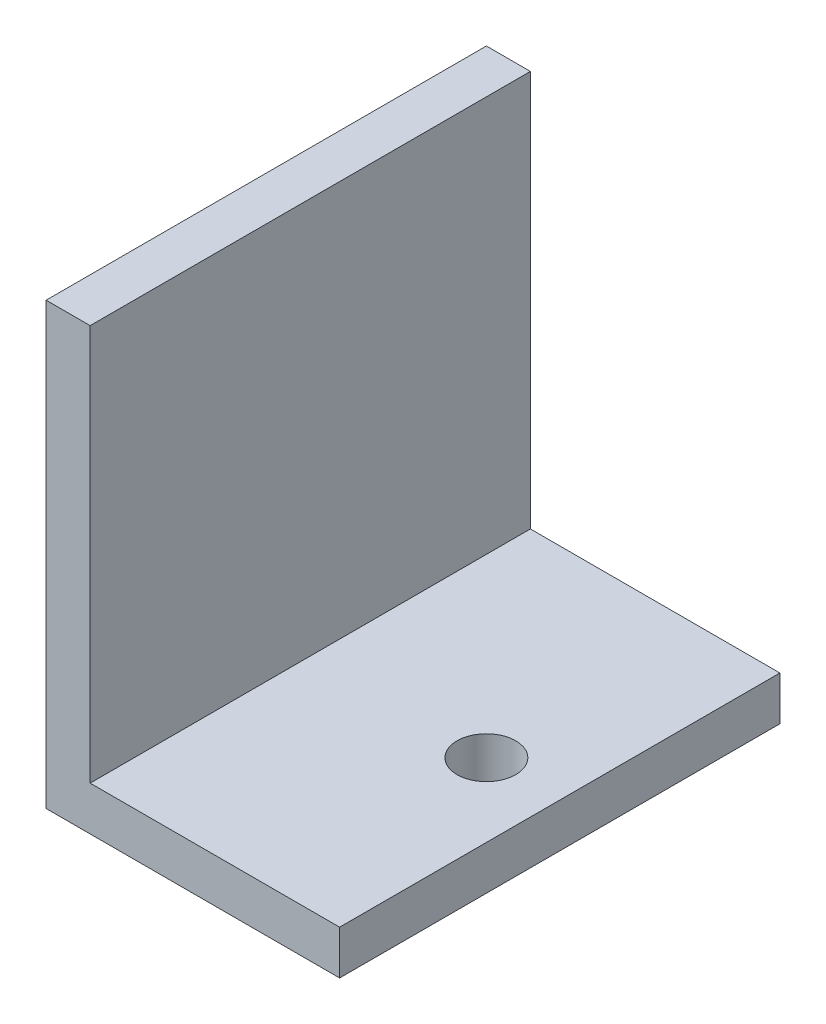
ISO-10303-21;
HEADER;
FILE_DESCRIPTION(('STEP AP214'),'2;1');
FILE_NAME('part.step','',(''),(''),'','','');
FILE_SCHEMA(('AUTOMOTIVE_DESIGN { 1 0 10303 214 1 1 1 1 }'));
ENDSEC;
DATA;
#1=APPLICATION_CONTEXT('core data for automotive mechanical design processes');
#2=APPLICATION_PROTOCOL_DEFINITION('international standard','automotive_design',2000,#1);
#3=PRODUCT_CONTEXT('',#1,'mechanical');
#4=PRODUCT('Part','Part','',(#3));
#5=PRODUCT_RELATED_PRODUCT_CATEGORY('part','',(#4));
#6=PRODUCT_DEFINITION_FORMATION('','',#4);
#7=PRODUCT_DEFINITION_CONTEXT('part definition',#1,'design');
#8=PRODUCT_DEFINITION('design','',#6,#7);
#9=PRODUCT_DEFINITION_SHAPE('','',#8);
#10=(LENGTH_UNIT() NAMED_UNIT(*) SI_UNIT(.MILLI.,.METRE.));
#11=(NAMED_UNIT(*) PLANE_ANGLE_UNIT() SI_UNIT($,.RADIAN.));
#12=(NAMED_UNIT(*) SI_UNIT($,.STERADIAN.) SOLID_ANGLE_UNIT());
#13=UNCERTAINTY_MEASURE_WITH_UNIT(LENGTH_MEASURE(1.E-05),#10,'distance_accuracy_value','');
#14=(GEOMETRIC_REPRESENTATION_CONTEXT(3) GLOBAL_UNCERTAINTY_ASSIGNED_CONTEXT((#13)) GLOBAL_UNIT_ASSIGNED_CONTEXT((#10,
#11,#12)) REPRESENTATION_CONTEXT('',''));
#15=CARTESIAN_POINT('',(0.,0.,0.));
#16=DIRECTION('',(0.,0.,1.));
#17=DIRECTION('',(1.,0.,0.));
#18=AXIS2_PLACEMENT_3D('',#15,#16,#17);
#19=CARTESIAN_POINT('',(3.,0.,30.));
#20=DIRECTION('',(0.,-1.,0.));
#21=DIRECTION('',(0.,0.,-1.));
#22=AXIS2_PLACEMENT_3D('',#19,#20,#21);
#23=PLANE('',#22);
#24=DIRECTION('',(-1.,0.,0.));
#25=VECTOR('',#24,1.);
#26=CARTESIAN_POINT('',(3.,0.,0.));
#27=LINE('',#26,#25);
#28=CARTESIAN_POINT('',(3.,0.,0.));
#29=VERTEX_POINT('',#28);
#30=CARTESIAN_POINT('',(0.,0.,0.));
#31=VERTEX_POINT('',#30);
#32=EDGE_CURVE('E135',#29,#31,#27,.T.);
#33=ORIENTED_EDGE('',*,*,#32,.T.);
#34=DIRECTION('',(0.,0.,-1.));
#35=VECTOR('',#34,1.);
#36=CARTESIAN_POINT('',(0.,0.,30.));
#37=LINE('',#36,#35);
#38=CARTESIAN_POINT('',(0.,0.,30.));
#39=VERTEX_POINT('',#38);
#40=EDGE_CURVE('E47',#39,#31,#37,.T.);
#41=ORIENTED_EDGE('',*,*,#40,.F.);
#42=DIRECTION('',(-1.,0.,0.));
#43=VECTOR('',#42,1.);
#44=CARTESIAN_POINT('',(3.,0.,30.));
#45=LINE('',#44,#43);
#46=CARTESIAN_POINT('',(3.,0.,30.));
#47=VERTEX_POINT('',#46);
#48=EDGE_CURVE('E118',#47,#39,#45,.T.);
#49=ORIENTED_EDGE('',*,*,#48,.F.);
#50=DIRECTION('',(0.,0.,-1.));
#51=VECTOR('',#50,1.);
#52=CARTESIAN_POINT('',(3.,0.,30.));
#53=LINE('',#52,#51);
#54=EDGE_CURVE('E124',#47,#29,#53,.T.);
#55=ORIENTED_EDGE('',*,*,#54,.T.);
#56=EDGE_LOOP('',(#33,#41,#49,#55));
#57=FACE_BOUND('',#56,.T.);
#58=ADVANCED_FACE('F40',(#57),#23,.F.);
#59=CARTESIAN_POINT('',(0.,0.,30.));
#60=DIRECTION('',(1.,0.,0.));
#61=DIRECTION('',(0.,0.,-1.));
#62=AXIS2_PLACEMENT_3D('',#59,#60,#61);
#63=PLANE('',#62);
#64=DIRECTION('',(0.,-1.,0.));
#65=VECTOR('',#64,1.);
#66=CARTESIAN_POINT('',(0.,0.,0.));
#67=LINE('',#66,#65);
#68=CARTESIAN_POINT('',(0.,-30.,0.));
#69=VERTEX_POINT('',#68);
#70=EDGE_CURVE('E120',#31,#69,#67,.T.);
#71=ORIENTED_EDGE('',*,*,#70,.T.);
#72=DIRECTION('',(0.,0.,-1.));
#73=VECTOR('',#72,1.);
#74=CARTESIAN_POINT('',(0.,-30.,30.));
#75=LINE('',#74,#73);
#76=CARTESIAN_POINT('',(0.,-30.,30.));
#77=VERTEX_POINT('',#76);
#78=EDGE_CURVE('E128',#77,#69,#75,.T.);
#79=ORIENTED_EDGE('',*,*,#78,.F.);
#80=DIRECTION('',(0.,-1.,0.));
#81=VECTOR('',#80,1.);
#82=CARTESIAN_POINT('',(0.,0.,30.));
#83=LINE('',#82,#81);
#84=EDGE_CURVE('E91',#39,#77,#83,.T.);
#85=ORIENTED_EDGE('',*,*,#84,.F.);
#86=ORIENTED_EDGE('',*,*,#40,.T.);
#87=EDGE_LOOP('',(#71,#79,#85,#86));
#88=FACE_BOUND('',#87,.T.);
#89=ADVANCED_FACE('F132',(#88),#63,.F.);
#90=CARTESIAN_POINT('',(0.,-30.,30.));
#91=DIRECTION('',(0.,1.,0.));
#92=DIRECTION('',(0.,0.,1.));
#93=AXIS2_PLACEMENT_3D('',#90,#91,#92);
#94=PLANE('',#93);
#95=CARTESIAN_POINT('',(15.,-30.,15.));
#96=DIRECTION('',(0.,1.,0.));
#97=DIRECTION('',(0.,0.,1.));
#98=AXIS2_PLACEMENT_3D('',#95,#96,#97);
#99=CIRCLE('',#98,2.);
#100=CARTESIAN_POINT('',(15.,-30.,17.));
#101=VERTEX_POINT('',#100);
#102=EDGE_CURVE('E136',#101,#101,#99,.T.);
#103=ORIENTED_EDGE('',*,*,#102,.T.);
#104=EDGE_LOOP('',(#103));
#105=FACE_BOUND('',#104,.T.);
#106=DIRECTION('',(1.,0.,0.));
#107=VECTOR('',#106,1.);
#108=CARTESIAN_POINT('',(0.,-30.,0.));
#109=LINE('',#108,#107);
#110=CARTESIAN_POINT('',(20.,-30.,0.));
#111=VERTEX_POINT('',#110);
#112=EDGE_CURVE('E116',#69,#111,#109,.T.);
#113=ORIENTED_EDGE('',*,*,#112,.T.);
#114=DIRECTION('',(0.,0.,1.));
#115=VECTOR('',#114,1.);
#116=CARTESIAN_POINT('',(20.,-30.,30.));
#117=LINE('',#116,#115);
#118=CARTESIAN_POINT('',(20.,-30.,30.));
#119=VERTEX_POINT('',#118);
#120=EDGE_CURVE('E54',#111,#119,#117,.T.);
#121=ORIENTED_EDGE('',*,*,#120,.T.);
#122=DIRECTION('',(1.,0.,0.));
#123=VECTOR('',#122,1.);
#124=CARTESIAN_POINT('',(0.,-30.,30.));
#125=LINE('',#124,#123);
#126=EDGE_CURVE('E144',#77,#119,#125,.T.);
#127=ORIENTED_EDGE('',*,*,#126,.F.);
#128=ORIENTED_EDGE('',*,*,#78,.T.);
#129=EDGE_LOOP('',(#113,#121,#127,#128));
#130=FACE_BOUND('',#129,.T.);
#131=ADVANCED_FACE('F155',(#105,#130),#94,.F.);
#132=CARTESIAN_POINT('',(30.,-27.,30.));
#133=DIRECTION('',(0.,-1.,0.));
#134=DIRECTION('',(0.,0.,-1.));
#135=AXIS2_PLACEMENT_3D('',#132,#133,#134);
#136=PLANE('',#135);
#137=CARTESIAN_POINT('',(15.,-27.,15.));
#138=DIRECTION('',(0.,1.,0.));
#139=DIRECTION('',(0.,0.,1.));
#140=AXIS2_PLACEMENT_3D('',#137,#138,#139);
#141=CIRCLE('',#140,2.);
#142=CARTESIAN_POINT('',(15.,-27.,17.));
#143=VERTEX_POINT('',#142);
#144=EDGE_CURVE('E139',#143,#143,#141,.T.);
#145=ORIENTED_EDGE('',*,*,#144,.F.);
#146=EDGE_LOOP('',(#145));
#147=FACE_BOUND('',#146,.T.);
#148=DIRECTION('',(-1.,0.,0.));
#149=VECTOR('',#148,1.);
#150=CARTESIAN_POINT('',(30.,-27.,30.));
#151=LINE('',#150,#149);
#152=CARTESIAN_POINT('',(20.,-27.,30.));
#153=VERTEX_POINT('',#152);
#154=CARTESIAN_POINT('',(3.,-27.,30.));
#155=VERTEX_POINT('',#154);
#156=EDGE_CURVE('E111',#153,#155,#151,.T.);
#157=ORIENTED_EDGE('',*,*,#156,.F.);
#158=DIRECTION('',(0.,0.,1.));
#159=VECTOR('',#158,1.);
#160=CARTESIAN_POINT('',(20.,-27.,30.));
#161=LINE('',#160,#159);
#162=CARTESIAN_POINT('',(20.,-27.,0.));
#163=VERTEX_POINT('',#162);
#164=EDGE_CURVE('E100',#163,#153,#161,.T.);
#165=ORIENTED_EDGE('',*,*,#164,.F.);
#166=DIRECTION('',(-1.,0.,0.));
#167=VECTOR('',#166,1.);
#168=CARTESIAN_POINT('',(30.,-27.,0.));
#169=LINE('',#168,#167);
#170=CARTESIAN_POINT('',(3.,-27.,0.));
#171=VERTEX_POINT('',#170);
#172=EDGE_CURVE('E110',#163,#171,#169,.T.);
#173=ORIENTED_EDGE('',*,*,#172,.T.);
#174=DIRECTION('',(0.,0.,-1.));
#175=VECTOR('',#174,1.);
#176=CARTESIAN_POINT('',(3.,-27.,30.));
#177=LINE('',#176,#175);
#178=EDGE_CURVE('E126',#155,#171,#177,.T.);
#179=ORIENTED_EDGE('',*,*,#178,.F.);
#180=EDGE_LOOP('',(#157,#165,#173,#179));
#181=FACE_BOUND('',#180,.T.);
#182=ADVANCED_FACE('F108',(#147,#181),#136,.F.);
#183=CARTESIAN_POINT('',(3.,-27.,30.));
#184=DIRECTION('',(-1.,0.,0.));
#185=DIRECTION('',(0.,0.,1.));
#186=AXIS2_PLACEMENT_3D('',#183,#184,#185);
#187=PLANE('',#186);
#188=DIRECTION('',(0.,1.,0.));
#189=VECTOR('',#188,1.);
#190=CARTESIAN_POINT('',(3.,-27.,0.));
#191=LINE('',#190,#189);
#192=EDGE_CURVE('E83',#171,#29,#191,.T.);
#193=ORIENTED_EDGE('',*,*,#192,.T.);
#194=ORIENTED_EDGE('',*,*,#54,.F.);
#195=DIRECTION('',(0.,1.,0.));
#196=VECTOR('',#195,1.);
#197=CARTESIAN_POINT('',(3.,-27.,30.));
#198=LINE('',#197,#196);
#199=EDGE_CURVE('E62',#155,#47,#198,.T.);
#200=ORIENTED_EDGE('',*,*,#199,.F.);
#201=ORIENTED_EDGE('',*,*,#178,.T.);
#202=EDGE_LOOP('',(#193,#194,#200,#201));
#203=FACE_BOUND('',#202,.T.);
#204=ADVANCED_FACE('F163',(#203),#187,.F.);
#205=CARTESIAN_POINT('',(0.,0.,30.));
#206=DIRECTION('',(0.,0.,1.));
#207=DIRECTION('',(1.,0.,0.));
#208=AXIS2_PLACEMENT_3D('',#205,#206,#207);
#209=PLANE('',#208);
#210=DIRECTION('',(0.,1.,0.));
#211=VECTOR('',#210,1.);
#212=CARTESIAN_POINT('',(20.,-33.,30.));
#213=LINE('',#212,#211);
#214=EDGE_CURVE('E112',#119,#153,#213,.T.);
#215=ORIENTED_EDGE('',*,*,#214,.T.);
#216=ORIENTED_EDGE('',*,*,#156,.T.);
#217=ORIENTED_EDGE('',*,*,#199,.T.);
#218=ORIENTED_EDGE('',*,*,#48,.T.);
#219=ORIENTED_EDGE('',*,*,#84,.T.);
#220=ORIENTED_EDGE('',*,*,#126,.T.);
#221=EDGE_LOOP('',(#215,#216,#217,#218,#219,#220));
#222=FACE_BOUND('',#221,.T.);
#223=ADVANCED_FACE('F152',(#222),#209,.T.);
#224=CARTESIAN_POINT('',(0.,0.,0.));
#225=DIRECTION('',(0.,0.,1.));
#226=DIRECTION('',(1.,0.,0.));
#227=AXIS2_PLACEMENT_3D('',#224,#225,#226);
#228=PLANE('',#227);
#229=ORIENTED_EDGE('',*,*,#172,.F.);
#230=DIRECTION('',(0.,-1.,0.));
#231=VECTOR('',#230,1.);
#232=CARTESIAN_POINT('',(20.,0.,0.));
#233=LINE('',#232,#231);
#234=EDGE_CURVE('E11',#163,#111,#233,.T.);
#235=ORIENTED_EDGE('',*,*,#234,.T.);
#236=ORIENTED_EDGE('',*,*,#112,.F.);
#237=ORIENTED_EDGE('',*,*,#70,.F.);
#238=ORIENTED_EDGE('',*,*,#32,.F.);
#239=ORIENTED_EDGE('',*,*,#192,.F.);
#240=EDGE_LOOP('',(#229,#235,#236,#237,#238,#239));
#241=FACE_BOUND('',#240,.T.);
#242=ADVANCED_FACE('F114',(#241),#228,.F.);
#243=CARTESIAN_POINT('',(15.,-57.,15.));
#244=DIRECTION('',(0.,1.,0.));
#245=DIRECTION('',(0.,0.,1.));
#246=AXIS2_PLACEMENT_3D('',#243,#244,#245);
#247=CYLINDRICAL_SURFACE('',#246,2.);
#248=ORIENTED_EDGE('',*,*,#144,.T.);
#249=EDGE_LOOP('',(#248));
#250=FACE_BOUND('',#249,.T.);
#251=ORIENTED_EDGE('',*,*,#102,.F.);
#252=EDGE_LOOP('',(#251));
#253=FACE_BOUND('',#252,.T.);
#254=ADVANCED_FACE('F187',(#250,#253),#247,.F.);
#255=CARTESIAN_POINT('',(20.,-33.,30.));
#256=DIRECTION('',(-1.,0.,0.));
#257=DIRECTION('',(0.,0.,1.));
#258=AXIS2_PLACEMENT_3D('',#255,#256,#257);
#259=PLANE('',#258);
#260=ORIENTED_EDGE('',*,*,#234,.F.);
#261=ORIENTED_EDGE('',*,*,#164,.T.);
#262=ORIENTED_EDGE('',*,*,#214,.F.);
#263=ORIENTED_EDGE('',*,*,#120,.F.);
#264=EDGE_LOOP('',(#260,#261,#262,#263));
#265=FACE_BOUND('',#264,.T.);
#266=ADVANCED_FACE('F99',(#265),#259,.F.);
#267=CLOSED_SHELL('',(#58,#89,#131,#182,#204,#223,#242,#254,#266));
#268=MANIFOLD_SOLID_BREP('B2',#267);
#269=ADVANCED_BREP_SHAPE_REPRESENTATION('',(#18,#268),#14);
#270=SHAPE_DEFINITION_REPRESENTATION(#9,#269);
ENDSEC;
END-ISO-10303-21;
